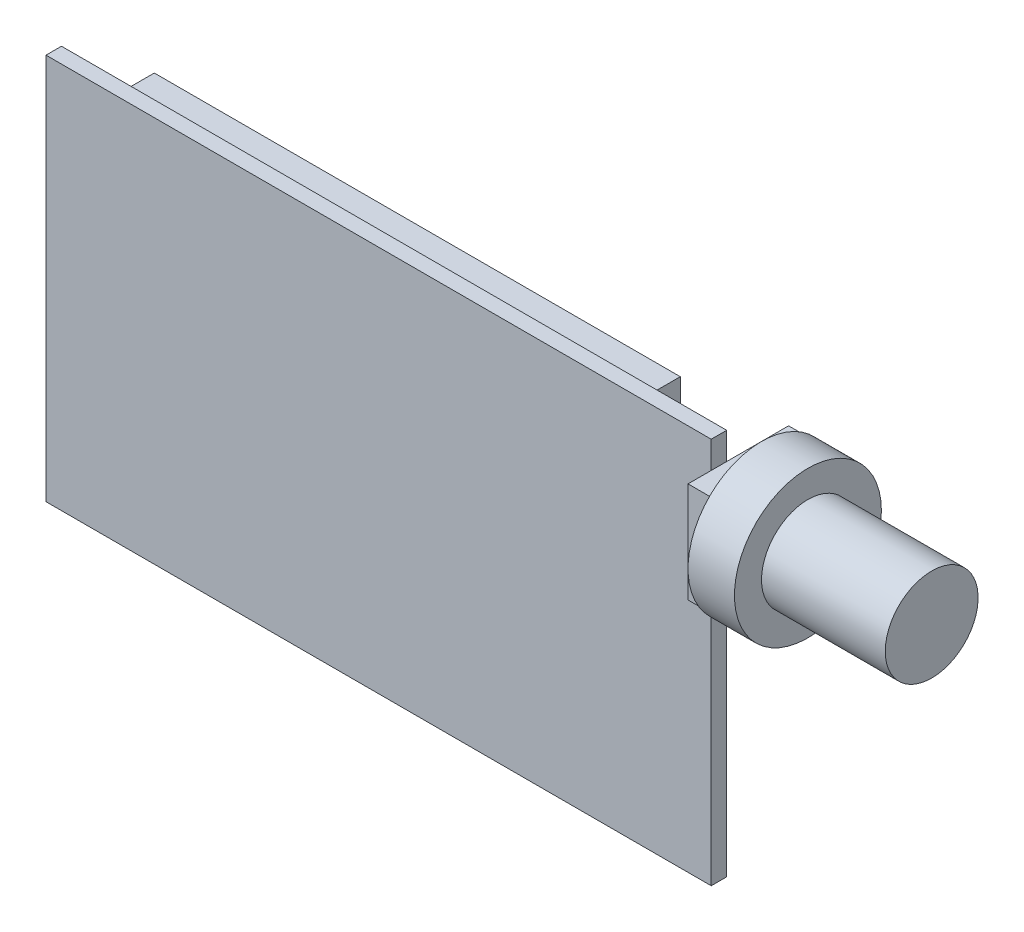
ISO-10303-21;
HEADER;
FILE_DESCRIPTION(('STEP AP214'),'2;1');
FILE_NAME('part.step','',(''),(''),'','','');
FILE_SCHEMA(('AUTOMOTIVE_DESIGN { 1 0 10303 214 1 1 1 1 }'));
ENDSEC;
DATA;
#1=APPLICATION_CONTEXT('core data for automotive mechanical design processes');
#2=APPLICATION_PROTOCOL_DEFINITION('international standard','automotive_design',2000,#1);
#3=PRODUCT_CONTEXT('',#1,'mechanical');
#4=PRODUCT('Part','Part','',(#3));
#5=PRODUCT_RELATED_PRODUCT_CATEGORY('part','',(#4));
#6=PRODUCT_DEFINITION_FORMATION('','',#4);
#7=PRODUCT_DEFINITION_CONTEXT('part definition',#1,'design');
#8=PRODUCT_DEFINITION('design','',#6,#7);
#9=PRODUCT_DEFINITION_SHAPE('','',#8);
#10=(LENGTH_UNIT() NAMED_UNIT(*) SI_UNIT(.MILLI.,.METRE.));
#11=(NAMED_UNIT(*) PLANE_ANGLE_UNIT() SI_UNIT($,.RADIAN.));
#12=(NAMED_UNIT(*) SI_UNIT($,.STERADIAN.) SOLID_ANGLE_UNIT());
#13=UNCERTAINTY_MEASURE_WITH_UNIT(LENGTH_MEASURE(1.E-05),#10,'distance_accuracy_value','');
#14=(GEOMETRIC_REPRESENTATION_CONTEXT(3) GLOBAL_UNCERTAINTY_ASSIGNED_CONTEXT((#13)) GLOBAL_UNIT_ASSIGNED_CONTEXT((#10,
#11,#12)) REPRESENTATION_CONTEXT('',''));
#15=CARTESIAN_POINT('',(0.,0.,0.));
#16=DIRECTION('',(0.,0.,1.));
#17=DIRECTION('',(1.,0.,0.));
#18=AXIS2_PLACEMENT_3D('',#15,#16,#17);
#19=CARTESIAN_POINT('',(21.5,-12.5,-1.));
#20=DIRECTION('',(1.,0.,0.));
#21=DIRECTION('',(0.,0.,-1.));
#22=AXIS2_PLACEMENT_3D('',#19,#20,#21);
#23=PLANE('',#22);
#24=DIRECTION('',(0.,0.,-1.));
#25=VECTOR('',#24,1.);
#26=CARTESIAN_POINT('',(21.5,4.25000000000001,1.5));
#27=LINE('',#26,#25);
#28=CARTESIAN_POINT('',(21.5,4.25000000000001,0.));
#29=VERTEX_POINT('',#28);
#30=CARTESIAN_POINT('',(21.5,4.25000000000001,-1.));
#31=VERTEX_POINT('',#30);
#32=EDGE_CURVE('E45',#29,#31,#27,.T.);
#33=ORIENTED_EDGE('',*,*,#32,.F.);
#34=DIRECTION('',(0.,1.,0.));
#35=VECTOR('',#34,1.);
#36=CARTESIAN_POINT('',(21.5,-12.5,0.));
#37=LINE('',#36,#35);
#38=CARTESIAN_POINT('',(21.5,-12.5,0.));
#39=VERTEX_POINT('',#38);
#40=EDGE_CURVE('E243',#39,#29,#37,.T.);
#41=ORIENTED_EDGE('',*,*,#40,.F.);
#42=DIRECTION('',(0.,0.,1.));
#43=VECTOR('',#42,1.);
#44=CARTESIAN_POINT('',(21.5,-12.5,-1.));
#45=LINE('',#44,#43);
#46=CARTESIAN_POINT('',(21.5,-12.5,-1.));
#47=VERTEX_POINT('',#46);
#48=EDGE_CURVE('E254',#47,#39,#45,.T.);
#49=ORIENTED_EDGE('',*,*,#48,.F.);
#50=DIRECTION('',(0.,1.,0.));
#51=VECTOR('',#50,1.);
#52=CARTESIAN_POINT('',(21.5,-12.5,-1.));
#53=LINE('',#52,#51);
#54=EDGE_CURVE('E231',#47,#31,#53,.T.);
#55=ORIENTED_EDGE('',*,*,#54,.T.);
#56=EDGE_LOOP('',(#33,#41,#49,#55));
#57=FACE_BOUND('',#56,.T.);
#58=ADVANCED_FACE('F37',(#57),#23,.T.);
#59=CARTESIAN_POINT('',(-21.5,-12.5,-1.));
#60=DIRECTION('',(-1.,0.,0.));
#61=DIRECTION('',(0.,0.,1.));
#62=AXIS2_PLACEMENT_3D('',#59,#60,#61);
#63=PLANE('',#62);
#64=DIRECTION('',(0.,-1.,0.));
#65=VECTOR('',#64,1.);
#66=CARTESIAN_POINT('',(-21.5,-12.5,0.));
#67=LINE('',#66,#65);
#68=CARTESIAN_POINT('',(-21.5,12.5,0.));
#69=VERTEX_POINT('',#68);
#70=CARTESIAN_POINT('',(-21.5,-12.5,0.));
#71=VERTEX_POINT('',#70);
#72=EDGE_CURVE('E222',#69,#71,#67,.T.);
#73=ORIENTED_EDGE('',*,*,#72,.F.);
#74=DIRECTION('',(0.,0.,1.));
#75=VECTOR('',#74,1.);
#76=CARTESIAN_POINT('',(-21.5,12.5,-1.));
#77=LINE('',#76,#75);
#78=CARTESIAN_POINT('',(-21.5,12.5,-1.));
#79=VERTEX_POINT('',#78);
#80=EDGE_CURVE('E249',#79,#69,#77,.T.);
#81=ORIENTED_EDGE('',*,*,#80,.F.);
#82=DIRECTION('',(0.,-1.,0.));
#83=VECTOR('',#82,1.);
#84=CARTESIAN_POINT('',(-21.5,-12.5,-1.));
#85=LINE('',#84,#83);
#86=CARTESIAN_POINT('',(-21.5,-12.5,-1.));
#87=VERTEX_POINT('',#86);
#88=EDGE_CURVE('E223',#79,#87,#85,.T.);
#89=ORIENTED_EDGE('',*,*,#88,.T.);
#90=DIRECTION('',(0.,0.,1.));
#91=VECTOR('',#90,1.);
#92=CARTESIAN_POINT('',(-21.5,-12.5,-1.));
#93=LINE('',#92,#91);
#94=EDGE_CURVE('E236',#87,#71,#93,.T.);
#95=ORIENTED_EDGE('',*,*,#94,.T.);
#96=EDGE_LOOP('',(#73,#81,#89,#95));
#97=FACE_BOUND('',#96,.T.);
#98=ADVANCED_FACE('F39',(#97),#63,.T.);
#99=CARTESIAN_POINT('',(21.5,12.5,-1.));
#100=DIRECTION('',(0.,1.,0.));
#101=DIRECTION('',(-1.,0.,0.));
#102=AXIS2_PLACEMENT_3D('',#99,#100,#101);
#103=PLANE('',#102);
#104=DIRECTION('',(-1.,0.,0.));
#105=VECTOR('',#104,1.);
#106=CARTESIAN_POINT('',(21.5,12.5,0.));
#107=LINE('',#106,#105);
#108=CARTESIAN_POINT('',(21.5,12.5,0.));
#109=VERTEX_POINT('',#108);
#110=EDGE_CURVE('E227',#109,#69,#107,.T.);
#111=ORIENTED_EDGE('',*,*,#110,.F.);
#112=DIRECTION('',(0.,0.,1.));
#113=VECTOR('',#112,1.);
#114=CARTESIAN_POINT('',(21.5,12.5,-1.));
#115=LINE('',#114,#113);
#116=CARTESIAN_POINT('',(21.5,12.5,-1.));
#117=VERTEX_POINT('',#116);
#118=EDGE_CURVE('E251',#117,#109,#115,.T.);
#119=ORIENTED_EDGE('',*,*,#118,.F.);
#120=DIRECTION('',(-1.,0.,0.));
#121=VECTOR('',#120,1.);
#122=CARTESIAN_POINT('',(21.5,12.5,-1.));
#123=LINE('',#122,#121);
#124=EDGE_CURVE('E233',#117,#79,#123,.T.);
#125=ORIENTED_EDGE('',*,*,#124,.T.);
#126=ORIENTED_EDGE('',*,*,#80,.T.);
#127=EDGE_LOOP('',(#111,#119,#125,#126));
#128=FACE_BOUND('',#127,.T.);
#129=ADVANCED_FACE('F269',(#128),#103,.T.);
#130=DIRECTION('',(0.,0.,1.));
#131=VECTOR('',#130,1.);
#132=CARTESIAN_POINT('',(21.5,10.75,1.5));
#133=LINE('',#132,#131);
#134=CARTESIAN_POINT('',(21.5,10.75,-1.));
#135=VERTEX_POINT('',#134);
#136=CARTESIAN_POINT('',(21.5,10.75,0.));
#137=VERTEX_POINT('',#136);
#138=EDGE_CURVE('E179',#135,#137,#133,.T.);
#139=ORIENTED_EDGE('',*,*,#138,.F.);
#140=EDGE_CURVE('E230',#135,#117,#53,.T.);
#141=ORIENTED_EDGE('',*,*,#140,.T.);
#142=ORIENTED_EDGE('',*,*,#118,.T.);
#143=EDGE_CURVE('E242',#137,#109,#37,.T.);
#144=ORIENTED_EDGE('',*,*,#143,.F.);
#145=EDGE_LOOP('',(#139,#141,#142,#144));
#146=FACE_BOUND('',#145,.T.);
#147=ADVANCED_FACE('F286',(#146),#23,.T.);
#148=CARTESIAN_POINT('',(21.5,-12.5,-1.));
#149=DIRECTION('',(0.,-1.,0.));
#150=DIRECTION('',(1.,0.,0.));
#151=AXIS2_PLACEMENT_3D('',#148,#149,#150);
#152=PLANE('',#151);
#153=DIRECTION('',(1.,0.,0.));
#154=VECTOR('',#153,1.);
#155=CARTESIAN_POINT('',(21.5,-12.5,0.));
#156=LINE('',#155,#154);
#157=EDGE_CURVE('E239',#71,#39,#156,.T.);
#158=ORIENTED_EDGE('',*,*,#157,.F.);
#159=ORIENTED_EDGE('',*,*,#94,.F.);
#160=DIRECTION('',(1.,0.,0.));
#161=VECTOR('',#160,1.);
#162=CARTESIAN_POINT('',(21.5,-12.5,-1.));
#163=LINE('',#162,#161);
#164=EDGE_CURVE('E226',#87,#47,#163,.T.);
#165=ORIENTED_EDGE('',*,*,#164,.T.);
#166=ORIENTED_EDGE('',*,*,#48,.T.);
#167=EDGE_LOOP('',(#158,#159,#165,#166));
#168=FACE_BOUND('',#167,.T.);
#169=ADVANCED_FACE('F261',(#168),#152,.T.);
#170=CARTESIAN_POINT('',(0.,0.,-1.));
#171=DIRECTION('',(0.,0.,1.));
#172=DIRECTION('',(1.,0.,0.));
#173=AXIS2_PLACEMENT_3D('',#170,#171,#172);
#174=PLANE('',#173);
#175=DIRECTION('',(-1.,0.,0.));
#176=VECTOR('',#175,1.);
#177=CARTESIAN_POINT('',(0.,11.,-1.));
#178=LINE('',#177,#176);
#179=CARTESIAN_POINT('',(15.5,11.,-1.));
#180=VERTEX_POINT('',#179);
#181=CARTESIAN_POINT('',(-18.5,11.,-1.));
#182=VERTEX_POINT('',#181);
#183=EDGE_CURVE('E216',#180,#182,#178,.T.);
#184=ORIENTED_EDGE('',*,*,#183,.T.);
#185=DIRECTION('',(0.,-1.,0.));
#186=VECTOR('',#185,1.);
#187=CARTESIAN_POINT('',(-18.5,0.,-1.));
#188=LINE('',#187,#186);
#189=CARTESIAN_POINT('',(-18.5,-11.,-1.));
#190=VERTEX_POINT('',#189);
#191=EDGE_CURVE('E219',#182,#190,#188,.T.);
#192=ORIENTED_EDGE('',*,*,#191,.T.);
#193=DIRECTION('',(1.,0.,0.));
#194=VECTOR('',#193,1.);
#195=CARTESIAN_POINT('',(0.,-11.,-1.));
#196=LINE('',#195,#194);
#197=CARTESIAN_POINT('',(15.5,-11.,-1.));
#198=VERTEX_POINT('',#197);
#199=EDGE_CURVE('E203',#190,#198,#196,.T.);
#200=ORIENTED_EDGE('',*,*,#199,.T.);
#201=DIRECTION('',(0.,1.,0.));
#202=VECTOR('',#201,1.);
#203=CARTESIAN_POINT('',(15.5,0.,-1.));
#204=LINE('',#203,#202);
#205=EDGE_CURVE('E213',#198,#180,#204,.T.);
#206=ORIENTED_EDGE('',*,*,#205,.T.);
#207=EDGE_LOOP('',(#184,#192,#200,#206));
#208=FACE_BOUND('',#207,.T.);
#209=ORIENTED_EDGE('',*,*,#88,.F.);
#210=ORIENTED_EDGE('',*,*,#124,.F.);
#211=ORIENTED_EDGE('',*,*,#140,.F.);
#212=EDGE_CURVE('E52',#31,#135,#53,.T.);
#213=ORIENTED_EDGE('',*,*,#212,.F.);
#214=ORIENTED_EDGE('',*,*,#54,.F.);
#215=ORIENTED_EDGE('',*,*,#164,.F.);
#216=EDGE_LOOP('',(#209,#210,#211,#213,#214,#215));
#217=FACE_BOUND('',#216,.T.);
#218=ADVANCED_FACE('F271',(#208,#217),#174,.F.);
#219=CARTESIAN_POINT('',(0.,0.,0.));
#220=DIRECTION('',(0.,0.,1.));
#221=DIRECTION('',(1.,0.,0.));
#222=AXIS2_PLACEMENT_3D('',#219,#220,#221);
#223=PLANE('',#222);
#224=ORIENTED_EDGE('',*,*,#72,.T.);
#225=ORIENTED_EDGE('',*,*,#157,.T.);
#226=ORIENTED_EDGE('',*,*,#40,.T.);
#227=EDGE_CURVE('E246',#29,#137,#37,.T.);
#228=ORIENTED_EDGE('',*,*,#227,.T.);
#229=ORIENTED_EDGE('',*,*,#143,.T.);
#230=ORIENTED_EDGE('',*,*,#110,.T.);
#231=EDGE_LOOP('',(#224,#225,#226,#228,#229,#230));
#232=FACE_BOUND('',#231,.T.);
#233=ADVANCED_FACE('F264',(#232),#223,.T.);
#234=CARTESIAN_POINT('',(-18.5,11.,-4.));
#235=DIRECTION('',(-1.,0.,0.));
#236=DIRECTION('',(0.,0.,1.));
#237=AXIS2_PLACEMENT_3D('',#234,#235,#236);
#238=PLANE('',#237);
#239=ORIENTED_EDGE('',*,*,#191,.F.);
#240=DIRECTION('',(0.,0.,1.));
#241=VECTOR('',#240,1.);
#242=CARTESIAN_POINT('',(-18.5,11.,-4.));
#243=LINE('',#242,#241);
#244=CARTESIAN_POINT('',(-18.5,11.,-4.));
#245=VERTEX_POINT('',#244);
#246=EDGE_CURVE('E200',#245,#182,#243,.T.);
#247=ORIENTED_EDGE('',*,*,#246,.F.);
#248=DIRECTION('',(0.,-1.,0.));
#249=VECTOR('',#248,1.);
#250=CARTESIAN_POINT('',(-18.5,11.,-4.));
#251=LINE('',#250,#249);
#252=CARTESIAN_POINT('',(-18.5,-11.,-4.));
#253=VERTEX_POINT('',#252);
#254=EDGE_CURVE('E187',#245,#253,#251,.T.);
#255=ORIENTED_EDGE('',*,*,#254,.T.);
#256=DIRECTION('',(0.,0.,1.));
#257=VECTOR('',#256,1.);
#258=CARTESIAN_POINT('',(-18.5,-11.,-4.));
#259=LINE('',#258,#257);
#260=EDGE_CURVE('E199',#253,#190,#259,.T.);
#261=ORIENTED_EDGE('',*,*,#260,.T.);
#262=EDGE_LOOP('',(#239,#247,#255,#261));
#263=FACE_BOUND('',#262,.T.);
#264=ADVANCED_FACE('F330',(#263),#238,.T.);
#265=CARTESIAN_POINT('',(-18.5,11.,-4.));
#266=DIRECTION('',(0.,1.,0.));
#267=DIRECTION('',(0.,0.,1.));
#268=AXIS2_PLACEMENT_3D('',#265,#266,#267);
#269=PLANE('',#268);
#270=ORIENTED_EDGE('',*,*,#183,.F.);
#271=DIRECTION('',(0.,0.,1.));
#272=VECTOR('',#271,1.);
#273=CARTESIAN_POINT('',(15.5,11.,-4.));
#274=LINE('',#273,#272);
#275=CARTESIAN_POINT('',(15.5,11.,-4.));
#276=VERTEX_POINT('',#275);
#277=EDGE_CURVE('E204',#276,#180,#274,.T.);
#278=ORIENTED_EDGE('',*,*,#277,.F.);
#279=DIRECTION('',(-1.,0.,0.));
#280=VECTOR('',#279,1.);
#281=CARTESIAN_POINT('',(-18.5,11.,-4.));
#282=LINE('',#281,#280);
#283=EDGE_CURVE('E196',#276,#245,#282,.T.);
#284=ORIENTED_EDGE('',*,*,#283,.T.);
#285=ORIENTED_EDGE('',*,*,#246,.T.);
#286=EDGE_LOOP('',(#270,#278,#284,#285));
#287=FACE_BOUND('',#286,.T.);
#288=ADVANCED_FACE('F335',(#287),#269,.T.);
#289=CARTESIAN_POINT('',(15.5,11.,-4.));
#290=DIRECTION('',(1.,0.,0.));
#291=DIRECTION('',(0.,0.,-1.));
#292=AXIS2_PLACEMENT_3D('',#289,#290,#291);
#293=PLANE('',#292);
#294=ORIENTED_EDGE('',*,*,#205,.F.);
#295=DIRECTION('',(0.,0.,1.));
#296=VECTOR('',#295,1.);
#297=CARTESIAN_POINT('',(15.5,-11.,-4.));
#298=LINE('',#297,#296);
#299=CARTESIAN_POINT('',(15.5,-11.,-4.));
#300=VERTEX_POINT('',#299);
#301=EDGE_CURVE('E207',#300,#198,#298,.T.);
#302=ORIENTED_EDGE('',*,*,#301,.F.);
#303=DIRECTION('',(0.,1.,0.));
#304=VECTOR('',#303,1.);
#305=CARTESIAN_POINT('',(15.5,11.,-4.));
#306=LINE('',#305,#304);
#307=EDGE_CURVE('E193',#300,#276,#306,.T.);
#308=ORIENTED_EDGE('',*,*,#307,.T.);
#309=ORIENTED_EDGE('',*,*,#277,.T.);
#310=EDGE_LOOP('',(#294,#302,#308,#309));
#311=FACE_BOUND('',#310,.T.);
#312=ADVANCED_FACE('F341',(#311),#293,.T.);
#313=CARTESIAN_POINT('',(-18.5,-11.,-4.));
#314=DIRECTION('',(0.,-1.,0.));
#315=DIRECTION('',(0.,0.,-1.));
#316=AXIS2_PLACEMENT_3D('',#313,#314,#315);
#317=PLANE('',#316);
#318=ORIENTED_EDGE('',*,*,#199,.F.);
#319=ORIENTED_EDGE('',*,*,#260,.F.);
#320=DIRECTION('',(1.,0.,0.));
#321=VECTOR('',#320,1.);
#322=CARTESIAN_POINT('',(-18.5,-11.,-4.));
#323=LINE('',#322,#321);
#324=EDGE_CURVE('E190',#253,#300,#323,.T.);
#325=ORIENTED_EDGE('',*,*,#324,.T.);
#326=ORIENTED_EDGE('',*,*,#301,.T.);
#327=EDGE_LOOP('',(#318,#319,#325,#326));
#328=FACE_BOUND('',#327,.T.);
#329=ADVANCED_FACE('F337',(#328),#317,.T.);
#330=CARTESIAN_POINT('',(0.,0.,-4.));
#331=DIRECTION('',(0.,0.,1.));
#332=DIRECTION('',(1.,0.,0.));
#333=AXIS2_PLACEMENT_3D('',#330,#331,#332);
#334=PLANE('',#333);
#335=ORIENTED_EDGE('',*,*,#254,.F.);
#336=ORIENTED_EDGE('',*,*,#283,.F.);
#337=ORIENTED_EDGE('',*,*,#307,.F.);
#338=ORIENTED_EDGE('',*,*,#324,.F.);
#339=EDGE_LOOP('',(#335,#336,#337,#338));
#340=FACE_BOUND('',#339,.T.);
#341=ADVANCED_FACE('F340',(#340),#334,.F.);
#342=CARTESIAN_POINT('',(21.5,0.,0.));
#343=DIRECTION('',(-1.,0.,0.));
#344=DIRECTION('',(0.,0.,1.));
#345=AXIS2_PLACEMENT_3D('',#342,#343,#344);
#346=PLANE('',#345);
#347=CARTESIAN_POINT('',(21.5,10.75,1.5));
#348=VERTEX_POINT('',#347);
#349=EDGE_CURVE('E173',#137,#348,#133,.T.);
#350=ORIENTED_EDGE('',*,*,#349,.F.);
#351=ORIENTED_EDGE('',*,*,#227,.F.);
#352=CARTESIAN_POINT('',(21.5,4.25000000000001,1.5));
#353=VERTEX_POINT('',#352);
#354=EDGE_CURVE('E151',#353,#29,#27,.T.);
#355=ORIENTED_EDGE('',*,*,#354,.F.);
#356=DIRECTION('',(0.,-1.,0.));
#357=VECTOR('',#356,1.);
#358=CARTESIAN_POINT('',(21.5,4.25000000000001,1.5));
#359=LINE('',#358,#357);
#360=EDGE_CURVE('E178',#348,#353,#359,.T.);
#361=ORIENTED_EDGE('',*,*,#360,.F.);
#362=EDGE_LOOP('',(#350,#351,#355,#361));
#363=FACE_BOUND('',#362,.T.);
#364=ADVANCED_FACE('F284',(#363),#346,.T.);
#365=CARTESIAN_POINT('',(23.,4.25000000000001,-5.));
#366=DIRECTION('',(0.,0.,1.));
#367=DIRECTION('',(1.,0.,0.));
#368=AXIS2_PLACEMENT_3D('',#365,#366,#367);
#369=PLANE('',#368);
#370=DIRECTION('',(0.,1.,0.));
#371=VECTOR('',#370,1.);
#372=CARTESIAN_POINT('',(21.5,4.25000000000001,-5.));
#373=LINE('',#372,#371);
#374=CARTESIAN_POINT('',(21.5,4.25000000000001,-5.));
#375=VERTEX_POINT('',#374);
#376=CARTESIAN_POINT('',(21.5,10.75,-5.));
#377=VERTEX_POINT('',#376);
#378=EDGE_CURVE('E171',#375,#377,#373,.T.);
#379=ORIENTED_EDGE('',*,*,#378,.T.);
#380=DIRECTION('',(-1.,0.,0.));
#381=VECTOR('',#380,1.);
#382=CARTESIAN_POINT('',(23.,10.75,-5.));
#383=LINE('',#382,#381);
#384=CARTESIAN_POINT('',(23.,10.75,-5.));
#385=VERTEX_POINT('',#384);
#386=EDGE_CURVE('E146',#385,#377,#383,.T.);
#387=ORIENTED_EDGE('',*,*,#386,.F.);
#388=DIRECTION('',(0.,1.,0.));
#389=VECTOR('',#388,1.);
#390=CARTESIAN_POINT('',(23.,4.25000000000001,-5.));
#391=LINE('',#390,#389);
#392=CARTESIAN_POINT('',(23.,4.25000000000001,-5.));
#393=VERTEX_POINT('',#392);
#394=EDGE_CURVE('E139',#393,#385,#391,.T.);
#395=ORIENTED_EDGE('',*,*,#394,.F.);
#396=DIRECTION('',(-1.,0.,0.));
#397=VECTOR('',#396,1.);
#398=CARTESIAN_POINT('',(23.,4.25000000000001,-5.));
#399=LINE('',#398,#397);
#400=EDGE_CURVE('E143',#393,#375,#399,.T.);
#401=ORIENTED_EDGE('',*,*,#400,.T.);
#402=EDGE_LOOP('',(#379,#387,#395,#401));
#403=FACE_BOUND('',#402,.T.);
#404=ADVANCED_FACE('F142',(#403),#369,.F.);
#405=CARTESIAN_POINT('',(23.,10.75,1.5));
#406=DIRECTION('',(0.,-1.,0.));
#407=DIRECTION('',(0.,0.,-1.));
#408=AXIS2_PLACEMENT_3D('',#405,#406,#407);
#409=PLANE('',#408);
#410=EDGE_CURVE('E175',#377,#135,#133,.T.);
#411=ORIENTED_EDGE('',*,*,#410,.T.);
#412=ORIENTED_EDGE('',*,*,#138,.T.);
#413=ORIENTED_EDGE('',*,*,#349,.T.);
#414=DIRECTION('',(-1.,0.,0.));
#415=VECTOR('',#414,1.);
#416=CARTESIAN_POINT('',(23.,10.75,1.5));
#417=LINE('',#416,#415);
#418=CARTESIAN_POINT('',(23.,10.75,1.5));
#419=VERTEX_POINT('',#418);
#420=EDGE_CURVE('E183',#419,#348,#417,.T.);
#421=ORIENTED_EDGE('',*,*,#420,.F.);
#422=DIRECTION('',(0.,0.,1.));
#423=VECTOR('',#422,1.);
#424=CARTESIAN_POINT('',(23.,10.75,1.5));
#425=LINE('',#424,#423);
#426=EDGE_CURVE('E150',#385,#419,#425,.T.);
#427=ORIENTED_EDGE('',*,*,#426,.F.);
#428=ORIENTED_EDGE('',*,*,#386,.T.);
#429=EDGE_LOOP('',(#411,#412,#413,#421,#427,#428));
#430=FACE_BOUND('',#429,.T.);
#431=ADVANCED_FACE('F278',(#430),#409,.F.);
#432=CARTESIAN_POINT('',(23.,4.25000000000001,1.5));
#433=DIRECTION('',(0.,0.,-1.));
#434=DIRECTION('',(0.,1.,0.));
#435=AXIS2_PLACEMENT_3D('',#432,#433,#434);
#436=PLANE('',#435);
#437=ORIENTED_EDGE('',*,*,#360,.T.);
#438=DIRECTION('',(-1.,0.,0.));
#439=VECTOR('',#438,1.);
#440=CARTESIAN_POINT('',(23.,4.25000000000001,1.5));
#441=LINE('',#440,#439);
#442=CARTESIAN_POINT('',(23.,4.25000000000001,1.5));
#443=VERTEX_POINT('',#442);
#444=EDGE_CURVE('E162',#443,#353,#441,.T.);
#445=ORIENTED_EDGE('',*,*,#444,.F.);
#446=DIRECTION('',(0.,-1.,0.));
#447=VECTOR('',#446,1.);
#448=CARTESIAN_POINT('',(23.,4.25000000000001,1.5));
#449=LINE('',#448,#447);
#450=EDGE_CURVE('E166',#419,#443,#449,.T.);
#451=ORIENTED_EDGE('',*,*,#450,.F.);
#452=ORIENTED_EDGE('',*,*,#420,.T.);
#453=EDGE_LOOP('',(#437,#445,#451,#452));
#454=FACE_BOUND('',#453,.T.);
#455=ADVANCED_FACE('F283',(#454),#436,.F.);
#456=CARTESIAN_POINT('',(23.,4.25000000000001,1.5));
#457=DIRECTION('',(0.,1.,0.));
#458=DIRECTION('',(0.,0.,1.));
#459=AXIS2_PLACEMENT_3D('',#456,#457,#458);
#460=PLANE('',#459);
#461=ORIENTED_EDGE('',*,*,#354,.T.);
#462=ORIENTED_EDGE('',*,*,#32,.T.);
#463=EDGE_CURVE('E161',#31,#375,#27,.T.);
#464=ORIENTED_EDGE('',*,*,#463,.T.);
#465=ORIENTED_EDGE('',*,*,#400,.F.);
#466=DIRECTION('',(0.,0.,-1.));
#467=VECTOR('',#466,1.);
#468=CARTESIAN_POINT('',(23.,4.25000000000001,1.5));
#469=LINE('',#468,#467);
#470=EDGE_CURVE('E158',#443,#393,#469,.T.);
#471=ORIENTED_EDGE('',*,*,#470,.F.);
#472=ORIENTED_EDGE('',*,*,#444,.T.);
#473=EDGE_LOOP('',(#461,#462,#464,#465,#471,#472));
#474=FACE_BOUND('',#473,.T.);
#475=ADVANCED_FACE('F156',(#474),#460,.F.);
#476=ORIENTED_EDGE('',*,*,#212,.T.);
#477=ORIENTED_EDGE('',*,*,#410,.F.);
#478=ORIENTED_EDGE('',*,*,#378,.F.);
#479=ORIENTED_EDGE('',*,*,#463,.F.);
#480=EDGE_LOOP('',(#476,#477,#478,#479));
#481=FACE_BOUND('',#480,.T.);
#482=ADVANCED_FACE('F273',(#481),#346,.T.);
#483=CARTESIAN_POINT('',(23.,7.50000000000001,-1.75));
#484=DIRECTION('',(1.,0.,0.));
#485=DIRECTION('',(0.,0.,-1.));
#486=AXIS2_PLACEMENT_3D('',#483,#484,#485);
#487=PLANE('',#486);
#488=CARTESIAN_POINT('',(23.,7.50000000000001,-1.75));
#489=DIRECTION('',(1.,0.,0.));
#490=DIRECTION('',(0.,0.,-1.));
#491=AXIS2_PLACEMENT_3D('',#488,#489,#490);
#492=CIRCLE('',#491,4.75);
#493=CARTESIAN_POINT('',(23.,7.50000000000001,-6.5));
#494=VERTEX_POINT('',#493);
#495=EDGE_CURVE('E291',#494,#494,#492,.T.);
#496=ORIENTED_EDGE('',*,*,#495,.F.);
#497=EDGE_LOOP('',(#496));
#498=FACE_BOUND('',#497,.T.);
#499=ORIENTED_EDGE('',*,*,#470,.T.);
#500=ORIENTED_EDGE('',*,*,#394,.T.);
#501=ORIENTED_EDGE('',*,*,#426,.T.);
#502=ORIENTED_EDGE('',*,*,#450,.T.);
#503=EDGE_LOOP('',(#499,#500,#501,#502));
#504=FACE_BOUND('',#503,.T.);
#505=ADVANCED_FACE('F164',(#498,#504),#487,.F.);
#506=CARTESIAN_POINT('',(26.,7.50000000000001,-1.75));
#507=DIRECTION('',(-1.,0.,0.));
#508=DIRECTION('',(0.,0.,1.));
#509=AXIS2_PLACEMENT_3D('',#506,#507,#508);
#510=CYLINDRICAL_SURFACE('',#509,4.75);
#511=CARTESIAN_POINT('',(26.,7.50000000000001,-1.75));
#512=DIRECTION('',(1.,0.,0.));
#513=DIRECTION('',(0.,0.,-1.));
#514=AXIS2_PLACEMENT_3D('',#511,#512,#513);
#515=CIRCLE('',#514,4.75);
#516=CARTESIAN_POINT('',(26.,7.50000000000001,-6.5));
#517=VERTEX_POINT('',#516);
#518=EDGE_CURVE('E290',#517,#517,#515,.T.);
#519=ORIENTED_EDGE('',*,*,#518,.F.);
#520=EDGE_LOOP('',(#519));
#521=FACE_BOUND('',#520,.T.);
#522=ORIENTED_EDGE('',*,*,#495,.T.);
#523=EDGE_LOOP('',(#522));
#524=FACE_BOUND('',#523,.T.);
#525=ADVANCED_FACE('F299',(#521,#524),#510,.T.);
#526=CARTESIAN_POINT('',(26.,7.50000000000001,-1.75));
#527=DIRECTION('',(1.,0.,0.));
#528=DIRECTION('',(0.,0.,-1.));
#529=AXIS2_PLACEMENT_3D('',#526,#527,#528);
#530=PLANE('',#529);
#531=CARTESIAN_POINT('',(26.,7.50000000000001,-1.75));
#532=DIRECTION('',(1.,0.,0.));
#533=DIRECTION('',(0.,0.,-1.));
#534=AXIS2_PLACEMENT_3D('',#531,#532,#533);
#535=CIRCLE('',#534,3.);
#536=CARTESIAN_POINT('',(26.,7.50000000000001,-4.75));
#537=VERTEX_POINT('',#536);
#538=EDGE_CURVE('E11',#537,#537,#535,.F.);
#539=ORIENTED_EDGE('',*,*,#538,.T.);
#540=EDGE_LOOP('',(#539));
#541=FACE_BOUND('',#540,.T.);
#542=ORIENTED_EDGE('',*,*,#518,.T.);
#543=EDGE_LOOP('',(#542));
#544=FACE_BOUND('',#543,.T.);
#545=ADVANCED_FACE('F297',(#541,#544),#530,.T.);
#546=CARTESIAN_POINT('',(34.,7.50000000000001,-1.75));
#547=DIRECTION('',(-1.,0.,0.));
#548=DIRECTION('',(0.,0.,1.));
#549=AXIS2_PLACEMENT_3D('',#546,#547,#548);
#550=PLANE('',#549);
#551=CARTESIAN_POINT('',(34.,7.50000000000001,-1.75));
#552=DIRECTION('',(-1.,0.,0.));
#553=DIRECTION('',(0.,0.,1.));
#554=AXIS2_PLACEMENT_3D('',#551,#552,#553);
#555=CIRCLE('',#554,3.);
#556=CARTESIAN_POINT('',(34.,7.50000000000001,1.25));
#557=VERTEX_POINT('',#556);
#558=EDGE_CURVE('E174',#557,#557,#555,.T.);
#559=ORIENTED_EDGE('',*,*,#558,.F.);
#560=EDGE_LOOP('',(#559));
#561=FACE_BOUND('',#560,.T.);
#562=ADVANCED_FACE('F363',(#561),#550,.F.);
#563=CARTESIAN_POINT('',(34.,7.50000000000001,-1.75));
#564=DIRECTION('',(-1.,0.,0.));
#565=DIRECTION('',(0.,0.,1.));
#566=AXIS2_PLACEMENT_3D('',#563,#564,#565);
#567=CYLINDRICAL_SURFACE('',#566,3.);
#568=ORIENTED_EDGE('',*,*,#538,.F.);
#569=EDGE_LOOP('',(#568));
#570=FACE_BOUND('',#569,.T.);
#571=ORIENTED_EDGE('',*,*,#558,.T.);
#572=EDGE_LOOP('',(#571));
#573=FACE_BOUND('',#572,.T.);
#574=ADVANCED_FACE('F360',(#570,#573),#567,.T.);
#575=CLOSED_SHELL('',(#58,#98,#129,#147,#169,#218,#233,#264,#288,#312,#329,#341,#364,#404,#431,
#455,#475,#482,#505,#525,#545,#562,#574));
#576=MANIFOLD_SOLID_BREP('B2',#575);
#577=ADVANCED_BREP_SHAPE_REPRESENTATION('',(#18,#576),#14);
#578=SHAPE_DEFINITION_REPRESENTATION(#9,#577);
ENDSEC;
END-ISO-10303-21;
